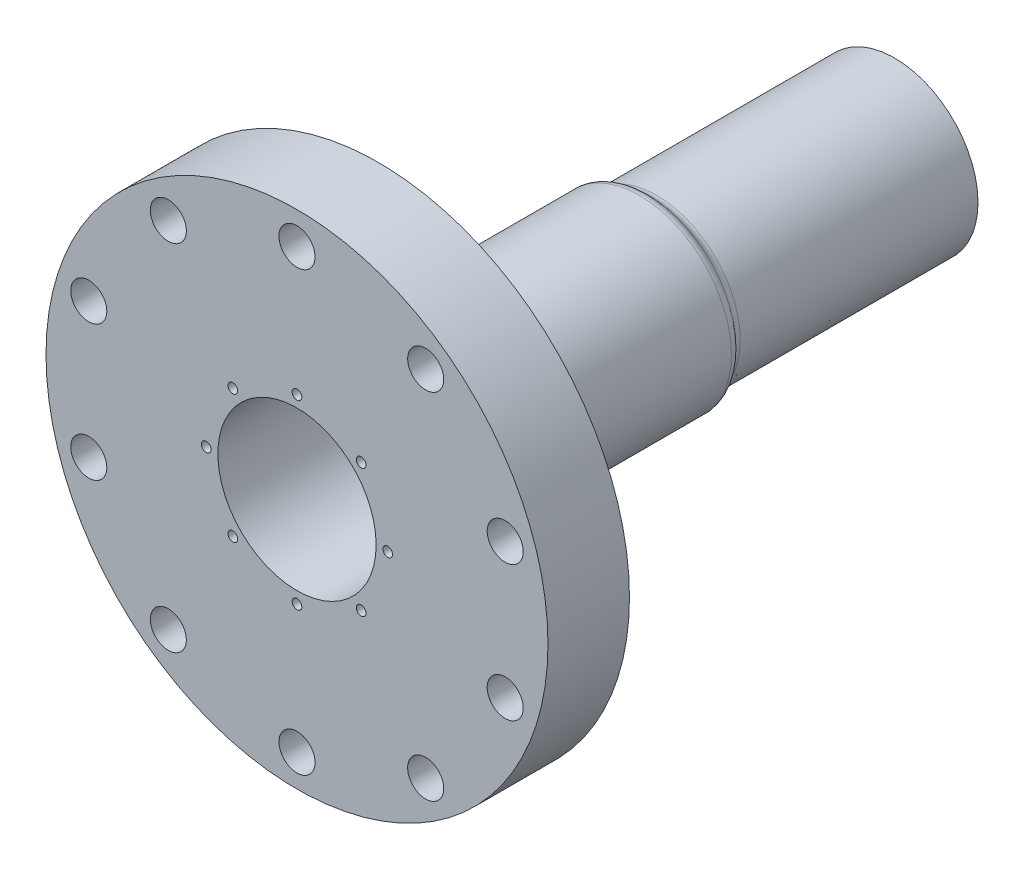
ISO-10303-21;
HEADER;
FILE_DESCRIPTION(('STEP AP214'),'2;1');
FILE_NAME('part.step','',(''),(''),'','','');
FILE_SCHEMA(('AUTOMOTIVE_DESIGN { 1 0 10303 214 1 1 1 1 }'));
ENDSEC;
DATA;
#1=APPLICATION_CONTEXT('core data for automotive mechanical design processes');
#2=APPLICATION_PROTOCOL_DEFINITION('international standard','automotive_design',2000,#1);
#3=PRODUCT_CONTEXT('',#1,'mechanical');
#4=PRODUCT('Part','Part','',(#3));
#5=PRODUCT_RELATED_PRODUCT_CATEGORY('part','',(#4));
#6=PRODUCT_DEFINITION_FORMATION('','',#4);
#7=PRODUCT_DEFINITION_CONTEXT('part definition',#1,'design');
#8=PRODUCT_DEFINITION('design','',#6,#7);
#9=PRODUCT_DEFINITION_SHAPE('','',#8);
#10=(LENGTH_UNIT() NAMED_UNIT(*) SI_UNIT(.MILLI.,.METRE.));
#11=(NAMED_UNIT(*) PLANE_ANGLE_UNIT() SI_UNIT($,.RADIAN.));
#12=(NAMED_UNIT(*) SI_UNIT($,.STERADIAN.) SOLID_ANGLE_UNIT());
#13=UNCERTAINTY_MEASURE_WITH_UNIT(LENGTH_MEASURE(1.E-05),#10,'distance_accuracy_value','');
#14=(GEOMETRIC_REPRESENTATION_CONTEXT(3) GLOBAL_UNCERTAINTY_ASSIGNED_CONTEXT((#13)) GLOBAL_UNIT_ASSIGNED_CONTEXT((#10,
#11,#12)) REPRESENTATION_CONTEXT('',''));
#15=CARTESIAN_POINT('',(0.,0.,0.));
#16=DIRECTION('',(0.,0.,1.));
#17=DIRECTION('',(1.,0.,0.));
#18=AXIS2_PLACEMENT_3D('',#15,#16,#17);
#19=CARTESIAN_POINT('',(0.,0.,-19.05));
#20=DIRECTION('',(0.,0.,1.));
#21=DIRECTION('',(1.,0.,0.));
#22=AXIS2_PLACEMENT_3D('',#19,#20,#21);
#23=PLANE('',#22);
#24=CARTESIAN_POINT('',(0.,0.,-19.05));
#25=DIRECTION('',(0.,0.,1.));
#26=DIRECTION('',(1.,0.,0.));
#27=AXIS2_PLACEMENT_3D('',#24,#25,#26);
#28=CIRCLE('',#27,58.674);
#29=CARTESIAN_POINT('',(58.674,0.,-19.05));
#30=VERTEX_POINT('',#29);
#31=EDGE_CURVE('E185',#30,#30,#28,.T.);
#32=ORIENTED_EDGE('',*,*,#31,.F.);
#33=EDGE_LOOP('',(#32));
#34=FACE_BOUND('',#33,.T.);
#35=CARTESIAN_POINT('',(0.,51.181,-19.05));
#36=DIRECTION('',(0.,0.,1.));
#37=DIRECTION('',(1.,0.,0.));
#38=AXIS2_PLACEMENT_3D('',#35,#36,#37);
#39=CIRCLE('',#38,4.2164);
#40=CARTESIAN_POINT('',(4.2164,51.181,-19.05));
#41=VERTEX_POINT('',#40);
#42=EDGE_CURVE('E181',#41,#41,#39,.F.);
#43=ORIENTED_EDGE('',*,*,#42,.F.);
#44=EDGE_LOOP('',(#43));
#45=FACE_BOUND('',#44,.T.);
#46=CARTESIAN_POINT('',(-30.0834369975811,41.4062987891042,-19.05));
#47=DIRECTION('',(0.,0.,1.));
#48=DIRECTION('',(1.,0.,0.));
#49=AXIS2_PLACEMENT_3D('',#46,#47,#48);
#50=CIRCLE('',#49,4.2164);
#51=CARTESIAN_POINT('',(-25.8670369975811,41.4062987891042,-19.05));
#52=VERTEX_POINT('',#51);
#53=EDGE_CURVE('E175',#52,#52,#50,.F.);
#54=ORIENTED_EDGE('',*,*,#53,.F.);
#55=EDGE_LOOP('',(#54));
#56=FACE_BOUND('',#55,.T.);
#57=CARTESIAN_POINT('',(-48.6760235605023,15.8157987891041,-19.05));
#58=DIRECTION('',(0.,0.,1.));
#59=DIRECTION('',(1.,0.,0.));
#60=AXIS2_PLACEMENT_3D('',#57,#58,#59);
#61=CIRCLE('',#60,4.2164);
#62=CARTESIAN_POINT('',(-44.4596235605023,15.8157987891041,-19.05));
#63=VERTEX_POINT('',#62);
#64=EDGE_CURVE('E169',#63,#63,#61,.F.);
#65=ORIENTED_EDGE('',*,*,#64,.F.);
#66=EDGE_LOOP('',(#65));
#67=FACE_BOUND('',#66,.T.);
#68=CARTESIAN_POINT('',(-48.6760235605022,-15.8157987891044,-19.05));
#69=DIRECTION('',(0.,0.,1.));
#70=DIRECTION('',(1.,0.,0.));
#71=AXIS2_PLACEMENT_3D('',#68,#69,#70);
#72=CIRCLE('',#71,4.2164);
#73=CARTESIAN_POINT('',(-44.4596235605022,-15.8157987891044,-19.05));
#74=VERTEX_POINT('',#73);
#75=EDGE_CURVE('E163',#74,#74,#72,.F.);
#76=ORIENTED_EDGE('',*,*,#75,.F.);
#77=EDGE_LOOP('',(#76));
#78=FACE_BOUND('',#77,.T.);
#79=CARTESIAN_POINT('',(-30.0834369975808,-41.4062987891044,-19.05));
#80=DIRECTION('',(0.,0.,1.));
#81=DIRECTION('',(1.,0.,0.));
#82=AXIS2_PLACEMENT_3D('',#79,#80,#81);
#83=CIRCLE('',#82,4.2164);
#84=CARTESIAN_POINT('',(-25.8670369975808,-41.4062987891044,-19.05));
#85=VERTEX_POINT('',#84);
#86=EDGE_CURVE('E157',#85,#85,#83,.F.);
#87=ORIENTED_EDGE('',*,*,#86,.F.);
#88=EDGE_LOOP('',(#87));
#89=FACE_BOUND('',#88,.T.);
#90=CARTESIAN_POINT('',(3.57395219809879E-13,-51.181,-19.05));
#91=DIRECTION('',(0.,0.,1.));
#92=DIRECTION('',(1.,0.,0.));
#93=AXIS2_PLACEMENT_3D('',#90,#91,#92);
#94=CIRCLE('',#93,4.2164);
#95=CARTESIAN_POINT('',(4.21640000000036,-51.181,-19.05));
#96=VERTEX_POINT('',#95);
#97=EDGE_CURVE('E151',#96,#96,#94,.F.);
#98=ORIENTED_EDGE('',*,*,#97,.F.);
#99=EDGE_LOOP('',(#98));
#100=FACE_BOUND('',#99,.T.);
#101=CARTESIAN_POINT('',(30.0834369975814,-41.4062987891039,-19.05));
#102=DIRECTION('',(0.,0.,1.));
#103=DIRECTION('',(1.,0.,0.));
#104=AXIS2_PLACEMENT_3D('',#101,#102,#103);
#105=CIRCLE('',#104,4.2164);
#106=CARTESIAN_POINT('',(34.2998369975814,-41.4062987891039,-19.05));
#107=VERTEX_POINT('',#106);
#108=EDGE_CURVE('E145',#107,#107,#105,.F.);
#109=ORIENTED_EDGE('',*,*,#108,.F.);
#110=EDGE_LOOP('',(#109));
#111=FACE_BOUND('',#110,.T.);
#112=CARTESIAN_POINT('',(48.6760235605024,-15.8157987891037,-19.05));
#113=DIRECTION('',(0.,0.,1.));
#114=DIRECTION('',(1.,0.,0.));
#115=AXIS2_PLACEMENT_3D('',#112,#113,#114);
#116=CIRCLE('',#115,4.2164);
#117=CARTESIAN_POINT('',(52.8924235605024,-15.8157987891037,-19.05));
#118=VERTEX_POINT('',#117);
#119=EDGE_CURVE('E139',#118,#118,#116,.F.);
#120=ORIENTED_EDGE('',*,*,#119,.F.);
#121=EDGE_LOOP('',(#120));
#122=FACE_BOUND('',#121,.T.);
#123=CARTESIAN_POINT('',(48.6760235605021,15.8157987891047,-19.05));
#124=DIRECTION('',(0.,0.,1.));
#125=DIRECTION('',(1.,0.,0.));
#126=AXIS2_PLACEMENT_3D('',#123,#124,#125);
#127=CIRCLE('',#126,4.2164);
#128=CARTESIAN_POINT('',(52.8924235605021,15.8157987891047,-19.05));
#129=VERTEX_POINT('',#128);
#130=EDGE_CURVE('E133',#129,#129,#127,.F.);
#131=ORIENTED_EDGE('',*,*,#130,.F.);
#132=EDGE_LOOP('',(#131));
#133=FACE_BOUND('',#132,.T.);
#134=CARTESIAN_POINT('',(30.0834369975805,41.4062987891046,-19.05));
#135=DIRECTION('',(0.,0.,1.));
#136=DIRECTION('',(1.,0.,0.));
#137=AXIS2_PLACEMENT_3D('',#134,#135,#136);
#138=CIRCLE('',#137,4.2164);
#139=CARTESIAN_POINT('',(34.2998369975805,41.4062987891046,-19.05));
#140=VERTEX_POINT('',#139);
#141=EDGE_CURVE('E127',#140,#140,#138,.F.);
#142=ORIENTED_EDGE('',*,*,#141,.F.);
#143=EDGE_LOOP('',(#142));
#144=FACE_BOUND('',#143,.T.);
#145=CARTESIAN_POINT('',(0.,0.,-19.05));
#146=DIRECTION('',(0.,0.,1.));
#147=DIRECTION('',(1.,0.,0.));
#148=AXIS2_PLACEMENT_3D('',#145,#146,#147);
#149=CIRCLE('',#148,21.5);
#150=CARTESIAN_POINT('',(21.5,0.,-19.05));
#151=VERTEX_POINT('',#150);
#152=EDGE_CURVE('E205',#151,#151,#149,.F.);
#153=ORIENTED_EDGE('',*,*,#152,.F.);
#154=EDGE_LOOP('',(#153));
#155=FACE_BOUND('',#154,.T.);
#156=ADVANCED_FACE('F32',(#34,#45,#56,#67,#78,#89,#100,#111,#122,#133,#144,#155),#23,.F.);
#157=CARTESIAN_POINT('',(0.,0.,-114.3));
#158=DIRECTION('',(0.,0.,-1.));
#159=DIRECTION('',(-1.,0.,0.));
#160=AXIS2_PLACEMENT_3D('',#157,#158,#159);
#161=CYLINDRICAL_SURFACE('',#160,19.);
#162=CARTESIAN_POINT('',(0.,0.,-114.3));
#163=DIRECTION('',(0.,0.,-1.));
#164=DIRECTION('',(-1.,0.,0.));
#165=AXIS2_PLACEMENT_3D('',#162,#163,#164);
#166=CIRCLE('',#165,19.);
#167=CARTESIAN_POINT('',(-19.,0.,-114.3));
#168=VERTEX_POINT('',#167);
#169=EDGE_CURVE('E199',#168,#168,#166,.T.);
#170=ORIENTED_EDGE('',*,*,#169,.F.);
#171=EDGE_LOOP('',(#170));
#172=FACE_BOUND('',#171,.T.);
#173=CARTESIAN_POINT('',(0.,0.,-130.320377846318));
#174=DIRECTION('',(0.,0.,-1.));
#175=DIRECTION('',(-1.,0.,0.));
#176=AXIS2_PLACEMENT_3D('',#173,#174,#175);
#177=CIRCLE('',#176,19.);
#178=CARTESIAN_POINT('',(-19.,0.,-130.320377846318));
#179=VERTEX_POINT('',#178);
#180=EDGE_CURVE('E202',#179,#179,#177,.F.);
#181=ORIENTED_EDGE('',*,*,#180,.F.);
#182=EDGE_LOOP('',(#181));
#183=FACE_BOUND('',#182,.T.);
#184=ADVANCED_FACE('F224',(#172,#183),#161,.F.);
#185=CARTESIAN_POINT('',(0.,0.,-139.7));
#186=DIRECTION('',(0.,0.,-1.));
#187=DIRECTION('',(-1.,0.,0.));
#188=AXIS2_PLACEMENT_3D('',#185,#186,#187);
#189=CIRCLE('',#188,19.);
#190=CARTESIAN_POINT('',(-19.,0.,-139.7));
#191=VERTEX_POINT('',#190);
#192=EDGE_CURVE('E678',#191,#191,#189,.T.);
#193=ORIENTED_EDGE('',*,*,#192,.T.);
#194=EDGE_LOOP('',(#193));
#195=FACE_BOUND('',#194,.T.);
#196=CARTESIAN_POINT('',(0.,0.,-135.766987298108));
#197=DIRECTION('',(0.,0.,1.));
#198=DIRECTION('',(1.,0.,0.));
#199=AXIS2_PLACEMENT_3D('',#196,#197,#198);
#200=CIRCLE('',#199,19.);
#201=CARTESIAN_POINT('',(19.,0.,-135.766987298108));
#202=VERTEX_POINT('',#201);
#203=EDGE_CURVE('E196',#202,#202,#200,.F.);
#204=ORIENTED_EDGE('',*,*,#203,.F.);
#205=EDGE_LOOP('',(#204));
#206=FACE_BOUND('',#205,.T.);
#207=ADVANCED_FACE('F230',(#195,#206),#161,.F.);
#208=CARTESIAN_POINT('',(0.,0.,-139.7));
#209=DIRECTION('',(0.,0.,1.));
#210=DIRECTION('',(1.,0.,0.));
#211=AXIS2_PLACEMENT_3D('',#208,#209,#210);
#212=CYLINDRICAL_SURFACE('',#211,18.5);
#213=CARTESIAN_POINT('',(0.,0.,0.));
#214=DIRECTION('',(0.,0.,1.));
#215=DIRECTION('',(1.,0.,0.));
#216=AXIS2_PLACEMENT_3D('',#213,#214,#215);
#217=CIRCLE('',#216,18.5);
#218=CARTESIAN_POINT('',(18.5,0.,0.));
#219=VERTEX_POINT('',#218);
#220=EDGE_CURVE('E188',#219,#219,#217,.T.);
#221=ORIENTED_EDGE('',*,*,#220,.T.);
#222=EDGE_LOOP('',(#221));
#223=FACE_BOUND('',#222,.T.);
#224=CARTESIAN_POINT('',(0.,0.,-114.3));
#225=DIRECTION('',(0.,0.,-1.));
#226=DIRECTION('',(-1.,0.,0.));
#227=AXIS2_PLACEMENT_3D('',#224,#225,#226);
#228=CIRCLE('',#227,18.5);
#229=CARTESIAN_POINT('',(-18.5,0.,-114.3));
#230=VERTEX_POINT('',#229);
#231=EDGE_CURVE('E82',#230,#230,#228,.F.);
#232=ORIENTED_EDGE('',*,*,#231,.F.);
#233=EDGE_LOOP('',(#232));
#234=FACE_BOUND('',#233,.T.);
#235=ADVANCED_FACE('F244',(#223,#234),#212,.F.);
#236=CARTESIAN_POINT('',(0.,0.,-139.7));
#237=DIRECTION('',(0.,0.,1.));
#238=DIRECTION('',(1.,0.,0.));
#239=AXIS2_PLACEMENT_3D('',#236,#237,#238);
#240=CYLINDRICAL_SURFACE('',#239,19.5);
#241=CARTESIAN_POINT('',(0.,0.,-84.1078672461467));
#242=DIRECTION('',(0.,0.,1.));
#243=DIRECTION('',(1.,0.,0.));
#244=AXIS2_PLACEMENT_3D('',#241,#242,#243);
#245=CIRCLE('',#244,19.5);
#246=CARTESIAN_POINT('',(19.5,0.,-84.1078672461467));
#247=VERTEX_POINT('',#246);
#248=EDGE_CURVE('E11',#247,#247,#245,.F.);
#249=ORIENTED_EDGE('',*,*,#248,.T.);
#250=EDGE_LOOP('',(#249));
#251=FACE_BOUND('',#250,.T.);
#252=CARTESIAN_POINT('',(0.,0.,-139.7));
#253=DIRECTION('',(0.,0.,1.));
#254=DIRECTION('',(1.,0.,0.));
#255=AXIS2_PLACEMENT_3D('',#252,#253,#254);
#256=CIRCLE('',#255,19.5);
#257=CARTESIAN_POINT('',(19.5,0.,-139.7));
#258=VERTEX_POINT('',#257);
#259=EDGE_CURVE('E193',#258,#258,#256,.T.);
#260=ORIENTED_EDGE('',*,*,#259,.T.);
#261=EDGE_LOOP('',(#260));
#262=FACE_BOUND('',#261,.T.);
#263=ADVANCED_FACE('F247',(#251,#262),#240,.T.);
#264=CARTESIAN_POINT('',(0.,0.,-139.7));
#265=DIRECTION('',(0.,0.,1.));
#266=DIRECTION('',(1.,0.,0.));
#267=AXIS2_PLACEMENT_3D('',#264,#265,#266);
#268=PLANE('',#267);
#269=ORIENTED_EDGE('',*,*,#192,.F.);
#270=EDGE_LOOP('',(#269));
#271=FACE_BOUND('',#270,.T.);
#272=ORIENTED_EDGE('',*,*,#259,.F.);
#273=EDGE_LOOP('',(#272));
#274=FACE_BOUND('',#273,.T.);
#275=ADVANCED_FACE('F249',(#271,#274),#268,.F.);
#276=CARTESIAN_POINT('',(0.,0.,0.));
#277=DIRECTION('',(0.,0.,1.));
#278=DIRECTION('',(1.,0.,0.));
#279=AXIS2_PLACEMENT_3D('',#276,#277,#278);
#280=PLANE('',#279);
#281=CARTESIAN_POINT('',(15.,-15.,0.));
#282=DIRECTION('',(0.,0.,1.));
#283=DIRECTION('',(1.,0.,0.));
#284=AXIS2_PLACEMENT_3D('',#281,#282,#283);
#285=CIRCLE('',#284,1.13029999999999);
#286=CARTESIAN_POINT('',(16.1303,-15.,0.));
#287=VERTEX_POINT('',#286);
#288=EDGE_CURVE('E76',#287,#287,#285,.T.);
#289=ORIENTED_EDGE('',*,*,#288,.F.);
#290=EDGE_LOOP('',(#289));
#291=FACE_BOUND('',#290,.T.);
#292=CARTESIAN_POINT('',(-15.,-15.,0.));
#293=DIRECTION('',(0.,0.,1.));
#294=DIRECTION('',(1.,0.,0.));
#295=AXIS2_PLACEMENT_3D('',#292,#293,#294);
#296=CIRCLE('',#295,1.13029999999999);
#297=CARTESIAN_POINT('',(-13.8697,-15.,0.));
#298=VERTEX_POINT('',#297);
#299=EDGE_CURVE('E75',#298,#298,#296,.T.);
#300=ORIENTED_EDGE('',*,*,#299,.F.);
#301=EDGE_LOOP('',(#300));
#302=FACE_BOUND('',#301,.T.);
#303=CARTESIAN_POINT('',(-15.,15.,0.));
#304=DIRECTION('',(0.,0.,1.));
#305=DIRECTION('',(1.,0.,0.));
#306=AXIS2_PLACEMENT_3D('',#303,#304,#305);
#307=CIRCLE('',#306,1.13029999999999);
#308=CARTESIAN_POINT('',(-13.8697,15.,0.));
#309=VERTEX_POINT('',#308);
#310=EDGE_CURVE('E88',#309,#309,#307,.T.);
#311=ORIENTED_EDGE('',*,*,#310,.F.);
#312=EDGE_LOOP('',(#311));
#313=FACE_BOUND('',#312,.T.);
#314=CARTESIAN_POINT('',(15.,15.,0.));
#315=DIRECTION('',(0.,0.,1.));
#316=DIRECTION('',(1.,0.,0.));
#317=AXIS2_PLACEMENT_3D('',#314,#315,#316);
#318=CIRCLE('',#317,1.13029999999999);
#319=CARTESIAN_POINT('',(16.1303,15.,0.));
#320=VERTEX_POINT('',#319);
#321=EDGE_CURVE('E94',#320,#320,#318,.T.);
#322=ORIENTED_EDGE('',*,*,#321,.F.);
#323=EDGE_LOOP('',(#322));
#324=FACE_BOUND('',#323,.T.);
#325=CARTESIAN_POINT('',(0.,21.2132034355964,0.));
#326=DIRECTION('',(0.,0.,1.));
#327=DIRECTION('',(1.,0.,0.));
#328=AXIS2_PLACEMENT_3D('',#325,#326,#327);
#329=CIRCLE('',#328,1.13029999999999);
#330=CARTESIAN_POINT('',(1.13030000000002,21.2132034355964,0.));
#331=VERTEX_POINT('',#330);
#332=EDGE_CURVE('E100',#331,#331,#329,.T.);
#333=ORIENTED_EDGE('',*,*,#332,.F.);
#334=EDGE_LOOP('',(#333));
#335=FACE_BOUND('',#334,.T.);
#336=CARTESIAN_POINT('',(-21.2132034355965,0.,0.));
#337=DIRECTION('',(0.,0.,1.));
#338=DIRECTION('',(1.,0.,0.));
#339=AXIS2_PLACEMENT_3D('',#336,#337,#338);
#340=CIRCLE('',#339,1.13029999999999);
#341=CARTESIAN_POINT('',(-20.0829034355965,0.,0.));
#342=VERTEX_POINT('',#341);
#343=EDGE_CURVE('E106',#342,#342,#340,.T.);
#344=ORIENTED_EDGE('',*,*,#343,.F.);
#345=EDGE_LOOP('',(#344));
#346=FACE_BOUND('',#345,.T.);
#347=CARTESIAN_POINT('',(21.2132034355965,0.,0.));
#348=DIRECTION('',(0.,0.,1.));
#349=DIRECTION('',(1.,0.,0.));
#350=AXIS2_PLACEMENT_3D('',#347,#348,#349);
#351=CIRCLE('',#350,1.13029999999999);
#352=CARTESIAN_POINT('',(22.3435034355964,0.,0.));
#353=VERTEX_POINT('',#352);
#354=EDGE_CURVE('E112',#353,#353,#351,.T.);
#355=ORIENTED_EDGE('',*,*,#354,.F.);
#356=EDGE_LOOP('',(#355));
#357=FACE_BOUND('',#356,.T.);
#358=CARTESIAN_POINT('',(0.,-21.2132034355964,0.));
#359=DIRECTION('',(0.,0.,1.));
#360=DIRECTION('',(1.,0.,0.));
#361=AXIS2_PLACEMENT_3D('',#358,#359,#360);
#362=CIRCLE('',#361,1.13029999999999);
#363=CARTESIAN_POINT('',(1.13029999999999,-21.2132034355964,0.));
#364=VERTEX_POINT('',#363);
#365=EDGE_CURVE('E118',#364,#364,#362,.T.);
#366=ORIENTED_EDGE('',*,*,#365,.F.);
#367=EDGE_LOOP('',(#366));
#368=FACE_BOUND('',#367,.T.);
#369=CARTESIAN_POINT('',(30.0834369975805,41.4062987891046,0.));
#370=DIRECTION('',(0.,0.,1.));
#371=DIRECTION('',(0.809016994374955,-0.587785252292462,0.));
#372=AXIS2_PLACEMENT_3D('',#369,#370,#371);
#373=CIRCLE('',#372,4.2164);
#374=CARTESIAN_POINT('',(33.4945762526631,38.9279610513386,0.));
#375=VERTEX_POINT('',#374);
#376=EDGE_CURVE('E124',#375,#375,#373,.T.);
#377=ORIENTED_EDGE('',*,*,#376,.F.);
#378=EDGE_LOOP('',(#377));
#379=FACE_BOUND('',#378,.T.);
#380=CARTESIAN_POINT('',(48.6760235605021,15.8157987891047,0.));
#381=DIRECTION('',(0.,0.,1.));
#382=DIRECTION('',(0.309016994374958,-0.95105651629515,0.));
#383=AXIS2_PLACEMENT_3D('',#380,#381,#382);
#384=CIRCLE('',#383,4.2164);
#385=CARTESIAN_POINT('',(49.9789628155847,11.8057640937979,0.));
#386=VERTEX_POINT('',#385);
#387=EDGE_CURVE('E130',#386,#386,#384,.T.);
#388=ORIENTED_EDGE('',*,*,#387,.F.);
#389=EDGE_LOOP('',(#388));
#390=FACE_BOUND('',#389,.T.);
#391=CARTESIAN_POINT('',(48.6760235605024,-15.8157987891037,0.));
#392=DIRECTION('',(0.,0.,1.));
#393=DIRECTION('',(-0.309016994374938,-0.951056516295157,0.));
#394=AXIS2_PLACEMENT_3D('',#391,#392,#393);
#395=CIRCLE('',#394,4.2164);
#396=CARTESIAN_POINT('',(47.3730843054199,-19.8258334844106,0.));
#397=VERTEX_POINT('',#396);
#398=EDGE_CURVE('E136',#397,#397,#395,.T.);
#399=ORIENTED_EDGE('',*,*,#398,.F.);
#400=EDGE_LOOP('',(#399));
#401=FACE_BOUND('',#400,.T.);
#402=CARTESIAN_POINT('',(30.0834369975814,-41.4062987891039,0.));
#403=DIRECTION('',(0.,0.,1.));
#404=DIRECTION('',(-0.809016994374942,-0.58778525229248,0.));
#405=AXIS2_PLACEMENT_3D('',#402,#403,#404);
#406=CIRCLE('',#405,4.2164);
#407=CARTESIAN_POINT('',(26.6722977424989,-43.8846365268699,0.));
#408=VERTEX_POINT('',#407);
#409=EDGE_CURVE('E142',#408,#408,#406,.T.);
#410=ORIENTED_EDGE('',*,*,#409,.F.);
#411=EDGE_LOOP('',(#410));
#412=FACE_BOUND('',#411,.T.);
#413=CARTESIAN_POINT('',(3.57395219809879E-13,-51.181,0.));
#414=DIRECTION('',(0.,0.,1.));
#415=DIRECTION('',(-1.,0.,0.));
#416=AXIS2_PLACEMENT_3D('',#413,#414,#415);
#417=CIRCLE('',#416,4.2164);
#418=CARTESIAN_POINT('',(-4.21639999999964,-51.181,0.));
#419=VERTEX_POINT('',#418);
#420=EDGE_CURVE('E148',#419,#419,#417,.T.);
#421=ORIENTED_EDGE('',*,*,#420,.F.);
#422=EDGE_LOOP('',(#421));
#423=FACE_BOUND('',#422,.T.);
#424=CARTESIAN_POINT('',(-30.0834369975808,-41.4062987891044,0.));
#425=DIRECTION('',(0.,0.,1.));
#426=DIRECTION('',(-0.809016994374951,0.587785252292469,0.));
#427=AXIS2_PLACEMENT_3D('',#424,#425,#426);
#428=CIRCLE('',#427,4.2164);
#429=CARTESIAN_POINT('',(-33.4945762526634,-38.9279610513384,0.));
#430=VERTEX_POINT('',#429);
#431=EDGE_CURVE('E154',#430,#430,#428,.T.);
#432=ORIENTED_EDGE('',*,*,#431,.F.);
#433=EDGE_LOOP('',(#432));
#434=FACE_BOUND('',#433,.T.);
#435=CARTESIAN_POINT('',(-48.6760235605022,-15.8157987891044,0.));
#436=DIRECTION('',(0.,0.,1.));
#437=DIRECTION('',(-0.309016994374952,0.951056516295152,0.));
#438=AXIS2_PLACEMENT_3D('',#435,#436,#437);
#439=CIRCLE('',#438,4.2164);
#440=CARTESIAN_POINT('',(-49.9789628155847,-11.8057640937975,0.));
#441=VERTEX_POINT('',#440);
#442=EDGE_CURVE('E160',#441,#441,#439,.T.);
#443=ORIENTED_EDGE('',*,*,#442,.F.);
#444=EDGE_LOOP('',(#443));
#445=FACE_BOUND('',#444,.T.);
#446=CARTESIAN_POINT('',(-48.6760235605023,15.8157987891041,0.));
#447=DIRECTION('',(0.,0.,1.));
#448=DIRECTION('',(0.309016994374945,0.951056516295155,0.));
#449=AXIS2_PLACEMENT_3D('',#446,#447,#448);
#450=CIRCLE('',#449,4.2164);
#451=CARTESIAN_POINT('',(-47.3730843054198,19.8258334844109,0.));
#452=VERTEX_POINT('',#451);
#453=EDGE_CURVE('E166',#452,#452,#450,.T.);
#454=ORIENTED_EDGE('',*,*,#453,.F.);
#455=EDGE_LOOP('',(#454));
#456=FACE_BOUND('',#455,.T.);
#457=CARTESIAN_POINT('',(-30.0834369975811,41.4062987891042,0.));
#458=DIRECTION('',(0.,0.,1.));
#459=DIRECTION('',(0.809016994374947,0.587785252292474,0.));
#460=AXIS2_PLACEMENT_3D('',#457,#458,#459);
#461=CIRCLE('',#460,4.2164);
#462=CARTESIAN_POINT('',(-26.6722977424986,43.8846365268701,0.));
#463=VERTEX_POINT('',#462);
#464=EDGE_CURVE('E172',#463,#463,#461,.T.);
#465=ORIENTED_EDGE('',*,*,#464,.F.);
#466=EDGE_LOOP('',(#465));
#467=FACE_BOUND('',#466,.T.);
#468=CARTESIAN_POINT('',(0.,51.181,0.));
#469=DIRECTION('',(0.,0.,1.));
#470=DIRECTION('',(1.,0.,0.));
#471=AXIS2_PLACEMENT_3D('',#468,#469,#470);
#472=CIRCLE('',#471,4.2164);
#473=CARTESIAN_POINT('',(4.2164,51.181,0.));
#474=VERTEX_POINT('',#473);
#475=EDGE_CURVE('E178',#474,#474,#472,.T.);
#476=ORIENTED_EDGE('',*,*,#475,.F.);
#477=EDGE_LOOP('',(#476));
#478=FACE_BOUND('',#477,.T.);
#479=ORIENTED_EDGE('',*,*,#220,.F.);
#480=EDGE_LOOP('',(#479));
#481=FACE_BOUND('',#480,.T.);
#482=CARTESIAN_POINT('',(0.,0.,0.));
#483=DIRECTION('',(0.,0.,1.));
#484=DIRECTION('',(1.,0.,0.));
#485=AXIS2_PLACEMENT_3D('',#482,#483,#484);
#486=CIRCLE('',#485,58.674);
#487=CARTESIAN_POINT('',(58.674,0.,0.));
#488=VERTEX_POINT('',#487);
#489=EDGE_CURVE('E184',#488,#488,#486,.T.);
#490=ORIENTED_EDGE('',*,*,#489,.T.);
#491=EDGE_LOOP('',(#490));
#492=FACE_BOUND('',#491,.T.);
#493=ADVANCED_FACE('F242',(#291,#302,#313,#324,#335,#346,#357,#368,#379,#390,#401,#412,#423,
#434,#445,#456,#467,#478,#481,#492),#280,.T.);
#494=CARTESIAN_POINT('',(0.,0.,-19.05));
#495=DIRECTION('',(0.,0.,1.));
#496=DIRECTION('',(1.,0.,0.));
#497=AXIS2_PLACEMENT_3D('',#494,#495,#496);
#498=CYLINDRICAL_SURFACE('',#497,58.674);
#499=CARTESIAN_POINT('',(58.674,0.,-19.05));
#500=CARTESIAN_POINT('',(58.674,0.,-18.8515625));
#501=CARTESIAN_POINT('',(58.674,0.,-18.653125));
#502=CARTESIAN_POINT('',(58.674,0.,-18.25625));
#503=CARTESIAN_POINT('',(58.674,0.,-18.0578125));
#504=CARTESIAN_POINT('',(58.674,0.,-17.6609375));
#505=CARTESIAN_POINT('',(58.674,0.,-17.4625));
#506=CARTESIAN_POINT('',(58.674,0.,-17.065625));
#507=CARTESIAN_POINT('',(58.674,0.,-16.8671875));
#508=CARTESIAN_POINT('',(58.674,0.,-16.4703125));
#509=CARTESIAN_POINT('',(58.674,0.,-16.271875));
#510=CARTESIAN_POINT('',(58.674,0.,-15.875));
#511=CARTESIAN_POINT('',(58.674,0.,-15.6765625));
#512=CARTESIAN_POINT('',(58.674,0.,-15.2796875));
#513=CARTESIAN_POINT('',(58.674,0.,-15.08125));
#514=CARTESIAN_POINT('',(58.674,0.,-14.684375));
#515=CARTESIAN_POINT('',(58.674,0.,-14.4859375));
#516=CARTESIAN_POINT('',(58.674,0.,-14.0890625));
#517=CARTESIAN_POINT('',(58.674,0.,-13.890625));
#518=CARTESIAN_POINT('',(58.674,0.,-13.49375));
#519=CARTESIAN_POINT('',(58.674,0.,-13.2953125));
#520=CARTESIAN_POINT('',(58.674,0.,-12.8984375));
#521=CARTESIAN_POINT('',(58.674,0.,-12.7));
#522=CARTESIAN_POINT('',(58.674,0.,-12.303125));
#523=CARTESIAN_POINT('',(58.674,0.,-12.1046875));
#524=CARTESIAN_POINT('',(58.674,0.,-11.7078125));
#525=CARTESIAN_POINT('',(58.674,0.,-11.509375));
#526=CARTESIAN_POINT('',(58.674,0.,-11.1125));
#527=CARTESIAN_POINT('',(58.674,0.,-10.9140625));
#528=CARTESIAN_POINT('',(58.674,0.,-10.5171875));
#529=CARTESIAN_POINT('',(58.674,0.,-10.31875));
#530=CARTESIAN_POINT('',(58.674,0.,-9.921875));
#531=CARTESIAN_POINT('',(58.674,0.,-9.7234375));
#532=CARTESIAN_POINT('',(58.674,0.,-9.3265625));
#533=CARTESIAN_POINT('',(58.674,0.,-9.128125));
#534=CARTESIAN_POINT('',(58.674,0.,-8.73125));
#535=CARTESIAN_POINT('',(58.674,0.,-8.5328125));
#536=CARTESIAN_POINT('',(58.674,0.,-8.1359375));
#537=CARTESIAN_POINT('',(58.674,0.,-7.9375));
#538=CARTESIAN_POINT('',(58.674,0.,-7.540625));
#539=CARTESIAN_POINT('',(58.674,0.,-7.3421875));
#540=CARTESIAN_POINT('',(58.674,0.,-6.9453125));
#541=CARTESIAN_POINT('',(58.674,0.,-6.746875));
#542=CARTESIAN_POINT('',(58.674,0.,-6.35));
#543=CARTESIAN_POINT('',(58.674,0.,-6.1515625));
#544=CARTESIAN_POINT('',(58.674,0.,-5.7546875));
#545=CARTESIAN_POINT('',(58.674,0.,-5.55625));
#546=CARTESIAN_POINT('',(58.674,0.,-5.159375));
#547=CARTESIAN_POINT('',(58.674,0.,-4.9609375));
#548=CARTESIAN_POINT('',(58.674,0.,-4.5640625));
#549=CARTESIAN_POINT('',(58.674,0.,-4.365625));
#550=CARTESIAN_POINT('',(58.674,0.,-3.96875));
#551=CARTESIAN_POINT('',(58.674,0.,-3.7703125));
#552=CARTESIAN_POINT('',(58.674,0.,-3.3734375));
#553=CARTESIAN_POINT('',(58.674,0.,-3.175));
#554=CARTESIAN_POINT('',(58.674,0.,-2.778125));
#555=CARTESIAN_POINT('',(58.674,0.,-2.5796875));
#556=CARTESIAN_POINT('',(58.674,0.,-2.1828125));
#557=CARTESIAN_POINT('',(58.674,0.,-1.984375));
#558=CARTESIAN_POINT('',(58.674,0.,-1.5875));
#559=CARTESIAN_POINT('',(58.674,0.,-1.3890625));
#560=CARTESIAN_POINT('',(58.674,0.,-0.992187500000001));
#561=CARTESIAN_POINT('',(58.674,0.,-0.793750000000001));
#562=CARTESIAN_POINT('',(58.674,0.,-0.396875));
#563=CARTESIAN_POINT('',(58.674,0.,-0.1984375));
#564=CARTESIAN_POINT('',(58.674,0.,0.));
#565=B_SPLINE_CURVE_WITH_KNOTS('',3,(#499,#500,#501,#502,#503,#504,#505,#506,#507,#508,#509,
#510,#511,#512,#513,#514,#515,#516,#517,#518,#519,#520,#521,#522,#523,#524,#525,#526,#527,#528,
#529,#530,#531,#532,#533,#534,#535,#536,#537,#538,#539,#540,#541,#542,#543,#544,#545,#546,#547,
#548,#549,#550,#551,#552,#553,#554,#555,#556,#557,#558,#559,#560,#561,#562,#563,#564),
.UNSPECIFIED.,.F.,.F.,(4,2,2,2,2,2,2,2,2,2,2,2,2,2,2,2,2,2,2,2,2,2,2,2,2,2,2,2,2,2,2,2,4),(0.,
0.595312499999997,1.190625,1.7859375,2.38125,2.9765625,3.571875,4.1671875,4.7625,5.3578125,
5.953125,6.5484375,7.14375,7.7390625,8.334375,8.9296875,9.525,10.1203125,10.715625,11.3109375,
11.90625,12.5015625,13.096875,13.6921875,14.2875,14.8828125,15.478125,16.0734375,16.66875,
17.2640625,17.859375,18.4546875,19.05),.UNSPECIFIED.);
#566=EDGE_CURVE('BSEAM239',#30,#488,#565,.T.);
#567=ORIENTED_EDGE('',*,*,#31,.T.);
#568=ORIENTED_EDGE('',*,*,#489,.F.);
#569=ORIENTED_EDGE('',*,*,#566,.T.);
#570=ORIENTED_EDGE('',*,*,#566,.F.);
#571=EDGE_LOOP('',(#567,#569,#568,#570));
#572=FACE_BOUND('',#571,.T.);
#573=ADVANCED_FACE('F239',(#572),#498,.T.);
#574=CARTESIAN_POINT('',(0.,51.181,-139.701));
#575=DIRECTION('',(0.,0.,1.));
#576=DIRECTION('',(1.,0.,0.));
#577=AXIS2_PLACEMENT_3D('',#574,#575,#576);
#578=CYLINDRICAL_SURFACE('',#577,4.2164);
#579=ORIENTED_EDGE('',*,*,#475,.T.);
#580=EDGE_LOOP('',(#579));
#581=FACE_BOUND('',#580,.T.);
#582=ORIENTED_EDGE('',*,*,#42,.T.);
#583=EDGE_LOOP('',(#582));
#584=FACE_BOUND('',#583,.T.);
#585=ADVANCED_FACE('F237',(#581,#584),#578,.F.);
#586=CARTESIAN_POINT('',(-30.0834369975811,41.4062987891042,-139.701));
#587=DIRECTION('',(0.,0.,1.));
#588=DIRECTION('',(1.,0.,0.));
#589=AXIS2_PLACEMENT_3D('',#586,#587,#588);
#590=CYLINDRICAL_SURFACE('',#589,4.2164);
#591=ORIENTED_EDGE('',*,*,#464,.T.);
#592=EDGE_LOOP('',(#591));
#593=FACE_BOUND('',#592,.T.);
#594=ORIENTED_EDGE('',*,*,#53,.T.);
#595=EDGE_LOOP('',(#594));
#596=FACE_BOUND('',#595,.T.);
#597=ADVANCED_FACE('F289',(#593,#596),#590,.F.);
#598=CARTESIAN_POINT('',(-48.6760235605023,15.8157987891041,-139.701));
#599=DIRECTION('',(0.,0.,1.));
#600=DIRECTION('',(1.,0.,0.));
#601=AXIS2_PLACEMENT_3D('',#598,#599,#600);
#602=CYLINDRICAL_SURFACE('',#601,4.2164);
#603=ORIENTED_EDGE('',*,*,#453,.T.);
#604=EDGE_LOOP('',(#603));
#605=FACE_BOUND('',#604,.T.);
#606=ORIENTED_EDGE('',*,*,#64,.T.);
#607=EDGE_LOOP('',(#606));
#608=FACE_BOUND('',#607,.T.);
#609=ADVANCED_FACE('F296',(#605,#608),#602,.F.);
#610=CARTESIAN_POINT('',(-48.6760235605022,-15.8157987891044,-139.701));
#611=DIRECTION('',(0.,0.,1.));
#612=DIRECTION('',(1.,0.,0.));
#613=AXIS2_PLACEMENT_3D('',#610,#611,#612);
#614=CYLINDRICAL_SURFACE('',#613,4.2164);
#615=ORIENTED_EDGE('',*,*,#442,.T.);
#616=EDGE_LOOP('',(#615));
#617=FACE_BOUND('',#616,.T.);
#618=ORIENTED_EDGE('',*,*,#75,.T.);
#619=EDGE_LOOP('',(#618));
#620=FACE_BOUND('',#619,.T.);
#621=ADVANCED_FACE('F303',(#617,#620),#614,.F.);
#622=CARTESIAN_POINT('',(-30.0834369975808,-41.4062987891044,-139.701));
#623=DIRECTION('',(0.,0.,1.));
#624=DIRECTION('',(1.,0.,0.));
#625=AXIS2_PLACEMENT_3D('',#622,#623,#624);
#626=CYLINDRICAL_SURFACE('',#625,4.2164);
#627=ORIENTED_EDGE('',*,*,#431,.T.);
#628=EDGE_LOOP('',(#627));
#629=FACE_BOUND('',#628,.T.);
#630=ORIENTED_EDGE('',*,*,#86,.T.);
#631=EDGE_LOOP('',(#630));
#632=FACE_BOUND('',#631,.T.);
#633=ADVANCED_FACE('F311',(#629,#632),#626,.F.);
#634=CARTESIAN_POINT('',(3.57395219809879E-13,-51.181,-139.701));
#635=DIRECTION('',(0.,0.,1.));
#636=DIRECTION('',(1.,0.,0.));
#637=AXIS2_PLACEMENT_3D('',#634,#635,#636);
#638=CYLINDRICAL_SURFACE('',#637,4.2164);
#639=ORIENTED_EDGE('',*,*,#420,.T.);
#640=EDGE_LOOP('',(#639));
#641=FACE_BOUND('',#640,.T.);
#642=ORIENTED_EDGE('',*,*,#97,.T.);
#643=EDGE_LOOP('',(#642));
#644=FACE_BOUND('',#643,.T.);
#645=ADVANCED_FACE('F319',(#641,#644),#638,.F.);
#646=CARTESIAN_POINT('',(30.0834369975814,-41.4062987891039,-139.701));
#647=DIRECTION('',(0.,0.,1.));
#648=DIRECTION('',(1.,0.,0.));
#649=AXIS2_PLACEMENT_3D('',#646,#647,#648);
#650=CYLINDRICAL_SURFACE('',#649,4.2164);
#651=ORIENTED_EDGE('',*,*,#409,.T.);
#652=EDGE_LOOP('',(#651));
#653=FACE_BOUND('',#652,.T.);
#654=ORIENTED_EDGE('',*,*,#108,.T.);
#655=EDGE_LOOP('',(#654));
#656=FACE_BOUND('',#655,.T.);
#657=ADVANCED_FACE('F327',(#653,#656),#650,.F.);
#658=CARTESIAN_POINT('',(48.6760235605024,-15.8157987891037,-139.701));
#659=DIRECTION('',(0.,0.,1.));
#660=DIRECTION('',(1.,0.,0.));
#661=AXIS2_PLACEMENT_3D('',#658,#659,#660);
#662=CYLINDRICAL_SURFACE('',#661,4.2164);
#663=ORIENTED_EDGE('',*,*,#398,.T.);
#664=EDGE_LOOP('',(#663));
#665=FACE_BOUND('',#664,.T.);
#666=ORIENTED_EDGE('',*,*,#119,.T.);
#667=EDGE_LOOP('',(#666));
#668=FACE_BOUND('',#667,.T.);
#669=ADVANCED_FACE('F335',(#665,#668),#662,.F.);
#670=CARTESIAN_POINT('',(48.6760235605021,15.8157987891047,-139.701));
#671=DIRECTION('',(0.,0.,1.));
#672=DIRECTION('',(1.,0.,0.));
#673=AXIS2_PLACEMENT_3D('',#670,#671,#672);
#674=CYLINDRICAL_SURFACE('',#673,4.2164);
#675=ORIENTED_EDGE('',*,*,#387,.T.);
#676=EDGE_LOOP('',(#675));
#677=FACE_BOUND('',#676,.T.);
#678=ORIENTED_EDGE('',*,*,#130,.T.);
#679=EDGE_LOOP('',(#678));
#680=FACE_BOUND('',#679,.T.);
#681=ADVANCED_FACE('F343',(#677,#680),#674,.F.);
#682=CARTESIAN_POINT('',(30.0834369975805,41.4062987891046,-139.701));
#683=DIRECTION('',(0.,0.,1.));
#684=DIRECTION('',(1.,0.,0.));
#685=AXIS2_PLACEMENT_3D('',#682,#683,#684);
#686=CYLINDRICAL_SURFACE('',#685,4.2164);
#687=ORIENTED_EDGE('',*,*,#376,.T.);
#688=EDGE_LOOP('',(#687));
#689=FACE_BOUND('',#688,.T.);
#690=ORIENTED_EDGE('',*,*,#141,.T.);
#691=EDGE_LOOP('',(#690));
#692=FACE_BOUND('',#691,.T.);
#693=ADVANCED_FACE('F351',(#689,#692),#686,.F.);
#694=CARTESIAN_POINT('',(0.,-21.2132034355964,-7.62));
#695=DIRECTION('',(0.,0.,1.));
#696=DIRECTION('',(1.,0.,0.));
#697=AXIS2_PLACEMENT_3D('',#694,#695,#696);
#698=CONICAL_SURFACE('',#697,1.13029999999999,1.02974425867665);
#699=CARTESIAN_POINT('',(0.,-21.2132034355964,-8.29915275768685));
#700=VERTEX_POINT('',#699);
#701=VERTEX_LOOP('',#700);
#702=FACE_BOUND('',#701,.T.);
#703=CARTESIAN_POINT('',(0.,-21.2132034355964,-7.62));
#704=DIRECTION('',(0.,0.,1.));
#705=DIRECTION('',(1.,0.,0.));
#706=AXIS2_PLACEMENT_3D('',#703,#704,#705);
#707=CIRCLE('',#706,1.13029999999999);
#708=CARTESIAN_POINT('',(1.13029999999998,-21.2132034355964,-7.62));
#709=VERTEX_POINT('',#708);
#710=EDGE_CURVE('E121',#709,#709,#707,.T.);
#711=ORIENTED_EDGE('',*,*,#710,.T.);
#712=EDGE_LOOP('',(#711));
#713=FACE_BOUND('',#712,.T.);
#714=ADVANCED_FACE('F358',(#702,#713),#698,.F.);
#715=CARTESIAN_POINT('',(0.,-21.2132034355964,0.));
#716=DIRECTION('',(0.,0.,1.));
#717=DIRECTION('',(1.,0.,0.));
#718=AXIS2_PLACEMENT_3D('',#715,#716,#717);
#719=CYLINDRICAL_SURFACE('',#718,1.13029999999999);
#720=ORIENTED_EDGE('',*,*,#710,.F.);
#721=EDGE_LOOP('',(#720));
#722=FACE_BOUND('',#721,.T.);
#723=ORIENTED_EDGE('',*,*,#365,.T.);
#724=EDGE_LOOP('',(#723));
#725=FACE_BOUND('',#724,.T.);
#726=ADVANCED_FACE('F365',(#722,#725),#719,.F.);
#727=CARTESIAN_POINT('',(21.2132034355965,0.,-7.62));
#728=DIRECTION('',(0.,0.,1.));
#729=DIRECTION('',(1.,0.,0.));
#730=AXIS2_PLACEMENT_3D('',#727,#728,#729);
#731=CONICAL_SURFACE('',#730,1.13029999999999,1.02974425867665);
#732=CARTESIAN_POINT('',(21.2132034355965,0.,-8.29915275768685));
#733=VERTEX_POINT('',#732);
#734=VERTEX_LOOP('',#733);
#735=FACE_BOUND('',#734,.T.);
#736=CARTESIAN_POINT('',(21.2132034355965,0.,-7.62));
#737=DIRECTION('',(0.,0.,1.));
#738=DIRECTION('',(1.,0.,0.));
#739=AXIS2_PLACEMENT_3D('',#736,#737,#738);
#740=CIRCLE('',#739,1.13029999999999);
#741=CARTESIAN_POINT('',(22.3435034355964,0.,-7.62));
#742=VERTEX_POINT('',#741);
#743=EDGE_CURVE('E115',#742,#742,#740,.T.);
#744=ORIENTED_EDGE('',*,*,#743,.T.);
#745=EDGE_LOOP('',(#744));
#746=FACE_BOUND('',#745,.T.);
#747=ADVANCED_FACE('F373',(#735,#746),#731,.F.);
#748=CARTESIAN_POINT('',(21.2132034355965,0.,0.));
#749=DIRECTION('',(0.,0.,1.));
#750=DIRECTION('',(1.,0.,0.));
#751=AXIS2_PLACEMENT_3D('',#748,#749,#750);
#752=CYLINDRICAL_SURFACE('',#751,1.13029999999999);
#753=ORIENTED_EDGE('',*,*,#743,.F.);
#754=EDGE_LOOP('',(#753));
#755=FACE_BOUND('',#754,.T.);
#756=ORIENTED_EDGE('',*,*,#354,.T.);
#757=EDGE_LOOP('',(#756));
#758=FACE_BOUND('',#757,.T.);
#759=ADVANCED_FACE('F381',(#755,#758),#752,.F.);
#760=CARTESIAN_POINT('',(-21.2132034355965,0.,-7.62));
#761=DIRECTION('',(0.,0.,1.));
#762=DIRECTION('',(1.,0.,0.));
#763=AXIS2_PLACEMENT_3D('',#760,#761,#762);
#764=CONICAL_SURFACE('',#763,1.13029999999999,1.02974425867665);
#765=CARTESIAN_POINT('',(-21.2132034355965,0.,-8.29915275768685));
#766=VERTEX_POINT('',#765);
#767=VERTEX_LOOP('',#766);
#768=FACE_BOUND('',#767,.T.);
#769=CARTESIAN_POINT('',(-21.2132034355965,0.,-7.62));
#770=DIRECTION('',(0.,0.,1.));
#771=DIRECTION('',(1.,0.,0.));
#772=AXIS2_PLACEMENT_3D('',#769,#770,#771);
#773=CIRCLE('',#772,1.13029999999999);
#774=CARTESIAN_POINT('',(-20.0829034355965,0.,-7.62));
#775=VERTEX_POINT('',#774);
#776=EDGE_CURVE('E109',#775,#775,#773,.T.);
#777=ORIENTED_EDGE('',*,*,#776,.T.);
#778=EDGE_LOOP('',(#777));
#779=FACE_BOUND('',#778,.T.);
#780=ADVANCED_FACE('F388',(#768,#779),#764,.F.);
#781=CARTESIAN_POINT('',(-21.2132034355965,0.,0.));
#782=DIRECTION('',(0.,0.,1.));
#783=DIRECTION('',(1.,0.,0.));
#784=AXIS2_PLACEMENT_3D('',#781,#782,#783);
#785=CYLINDRICAL_SURFACE('',#784,1.13029999999999);
#786=ORIENTED_EDGE('',*,*,#776,.F.);
#787=EDGE_LOOP('',(#786));
#788=FACE_BOUND('',#787,.T.);
#789=ORIENTED_EDGE('',*,*,#343,.T.);
#790=EDGE_LOOP('',(#789));
#791=FACE_BOUND('',#790,.T.);
#792=ADVANCED_FACE('F396',(#788,#791),#785,.F.);
#793=CARTESIAN_POINT('',(0.,21.2132034355964,-7.62));
#794=DIRECTION('',(0.,0.,1.));
#795=DIRECTION('',(1.,0.,0.));
#796=AXIS2_PLACEMENT_3D('',#793,#794,#795);
#797=CONICAL_SURFACE('',#796,1.13029999999999,1.02974425867665);
#798=CARTESIAN_POINT('',(0.,21.2132034355964,-8.29915275768685));
#799=VERTEX_POINT('',#798);
#800=VERTEX_LOOP('',#799);
#801=FACE_BOUND('',#800,.T.);
#802=CARTESIAN_POINT('',(0.,21.2132034355964,-7.62));
#803=DIRECTION('',(0.,0.,1.));
#804=DIRECTION('',(1.,0.,0.));
#805=AXIS2_PLACEMENT_3D('',#802,#803,#804);
#806=CIRCLE('',#805,1.13029999999999);
#807=CARTESIAN_POINT('',(1.13030000000002,21.2132034355964,-7.62));
#808=VERTEX_POINT('',#807);
#809=EDGE_CURVE('E103',#808,#808,#806,.T.);
#810=ORIENTED_EDGE('',*,*,#809,.T.);
#811=EDGE_LOOP('',(#810));
#812=FACE_BOUND('',#811,.T.);
#813=ADVANCED_FACE('F404',(#801,#812),#797,.F.);
#814=CARTESIAN_POINT('',(0.,21.2132034355964,0.));
#815=DIRECTION('',(0.,0.,1.));
#816=DIRECTION('',(1.,0.,0.));
#817=AXIS2_PLACEMENT_3D('',#814,#815,#816);
#818=CYLINDRICAL_SURFACE('',#817,1.13029999999999);
#819=ORIENTED_EDGE('',*,*,#809,.F.);
#820=EDGE_LOOP('',(#819));
#821=FACE_BOUND('',#820,.T.);
#822=ORIENTED_EDGE('',*,*,#332,.T.);
#823=EDGE_LOOP('',(#822));
#824=FACE_BOUND('',#823,.T.);
#825=ADVANCED_FACE('F412',(#821,#824),#818,.F.);
#826=CARTESIAN_POINT('',(15.,15.,-7.62));
#827=DIRECTION('',(0.,0.,1.));
#828=DIRECTION('',(1.,0.,0.));
#829=AXIS2_PLACEMENT_3D('',#826,#827,#828);
#830=CONICAL_SURFACE('',#829,1.13029999999999,1.02974425867665);
#831=CARTESIAN_POINT('',(15.,15.,-8.29915275768685));
#832=VERTEX_POINT('',#831);
#833=VERTEX_LOOP('',#832);
#834=FACE_BOUND('',#833,.T.);
#835=CARTESIAN_POINT('',(15.,15.,-7.62));
#836=DIRECTION('',(0.,0.,1.));
#837=DIRECTION('',(1.,0.,0.));
#838=AXIS2_PLACEMENT_3D('',#835,#836,#837);
#839=CIRCLE('',#838,1.13029999999999);
#840=CARTESIAN_POINT('',(16.1303,15.,-7.62));
#841=VERTEX_POINT('',#840);
#842=EDGE_CURVE('E97',#841,#841,#839,.T.);
#843=ORIENTED_EDGE('',*,*,#842,.T.);
#844=EDGE_LOOP('',(#843));
#845=FACE_BOUND('',#844,.T.);
#846=ADVANCED_FACE('F420',(#834,#845),#830,.F.);
#847=CARTESIAN_POINT('',(15.,15.,0.));
#848=DIRECTION('',(0.,0.,1.));
#849=DIRECTION('',(1.,0.,0.));
#850=AXIS2_PLACEMENT_3D('',#847,#848,#849);
#851=CYLINDRICAL_SURFACE('',#850,1.13029999999999);
#852=ORIENTED_EDGE('',*,*,#842,.F.);
#853=EDGE_LOOP('',(#852));
#854=FACE_BOUND('',#853,.T.);
#855=ORIENTED_EDGE('',*,*,#321,.T.);
#856=EDGE_LOOP('',(#855));
#857=FACE_BOUND('',#856,.T.);
#858=ADVANCED_FACE('F428',(#854,#857),#851,.F.);
#859=CARTESIAN_POINT('',(-15.,15.,-7.62));
#860=DIRECTION('',(0.,0.,1.));
#861=DIRECTION('',(1.,0.,0.));
#862=AXIS2_PLACEMENT_3D('',#859,#860,#861);
#863=CONICAL_SURFACE('',#862,1.13029999999999,1.02974425867665);
#864=CARTESIAN_POINT('',(-15.,15.,-8.29915275768685));
#865=VERTEX_POINT('',#864);
#866=VERTEX_LOOP('',#865);
#867=FACE_BOUND('',#866,.T.);
#868=CARTESIAN_POINT('',(-15.,15.,-7.62));
#869=DIRECTION('',(0.,0.,1.));
#870=DIRECTION('',(1.,0.,0.));
#871=AXIS2_PLACEMENT_3D('',#868,#869,#870);
#872=CIRCLE('',#871,1.13029999999999);
#873=CARTESIAN_POINT('',(-13.8697,15.,-7.62));
#874=VERTEX_POINT('',#873);
#875=EDGE_CURVE('E91',#874,#874,#872,.T.);
#876=ORIENTED_EDGE('',*,*,#875,.T.);
#877=EDGE_LOOP('',(#876));
#878=FACE_BOUND('',#877,.T.);
#879=ADVANCED_FACE('F436',(#867,#878),#863,.F.);
#880=CARTESIAN_POINT('',(-15.,15.,0.));
#881=DIRECTION('',(0.,0.,1.));
#882=DIRECTION('',(1.,0.,0.));
#883=AXIS2_PLACEMENT_3D('',#880,#881,#882);
#884=CYLINDRICAL_SURFACE('',#883,1.13029999999999);
#885=ORIENTED_EDGE('',*,*,#875,.F.);
#886=EDGE_LOOP('',(#885));
#887=FACE_BOUND('',#886,.T.);
#888=ORIENTED_EDGE('',*,*,#310,.T.);
#889=EDGE_LOOP('',(#888));
#890=FACE_BOUND('',#889,.T.);
#891=ADVANCED_FACE('F444',(#887,#890),#884,.F.);
#892=CARTESIAN_POINT('',(-15.,-15.,-7.62));
#893=DIRECTION('',(0.,0.,1.));
#894=DIRECTION('',(1.,0.,0.));
#895=AXIS2_PLACEMENT_3D('',#892,#893,#894);
#896=CONICAL_SURFACE('',#895,1.13029999999999,1.02974425867665);
#897=CARTESIAN_POINT('',(-15.,-15.,-8.29915275768685));
#898=VERTEX_POINT('',#897);
#899=VERTEX_LOOP('',#898);
#900=FACE_BOUND('',#899,.T.);
#901=CARTESIAN_POINT('',(-15.,-15.,-7.62));
#902=DIRECTION('',(0.,0.,1.));
#903=DIRECTION('',(1.,0.,0.));
#904=AXIS2_PLACEMENT_3D('',#901,#902,#903);
#905=CIRCLE('',#904,1.13029999999999);
#906=CARTESIAN_POINT('',(-13.8697,-15.,-7.62));
#907=VERTEX_POINT('',#906);
#908=EDGE_CURVE('E79',#907,#907,#905,.T.);
#909=ORIENTED_EDGE('',*,*,#908,.T.);
#910=EDGE_LOOP('',(#909));
#911=FACE_BOUND('',#910,.T.);
#912=ADVANCED_FACE('F452',(#900,#911),#896,.F.);
#913=CARTESIAN_POINT('',(-15.,-15.,0.));
#914=DIRECTION('',(0.,0.,1.));
#915=DIRECTION('',(1.,0.,0.));
#916=AXIS2_PLACEMENT_3D('',#913,#914,#915);
#917=CYLINDRICAL_SURFACE('',#916,1.13029999999999);
#918=ORIENTED_EDGE('',*,*,#908,.F.);
#919=EDGE_LOOP('',(#918));
#920=FACE_BOUND('',#919,.T.);
#921=ORIENTED_EDGE('',*,*,#299,.T.);
#922=EDGE_LOOP('',(#921));
#923=FACE_BOUND('',#922,.T.);
#924=ADVANCED_FACE('F69',(#920,#923),#917,.F.);
#925=CARTESIAN_POINT('',(15.,-15.,-7.62));
#926=DIRECTION('',(0.,0.,1.));
#927=DIRECTION('',(1.,0.,0.));
#928=AXIS2_PLACEMENT_3D('',#925,#926,#927);
#929=CONICAL_SURFACE('',#928,1.13029999999999,1.02974425867665);
#930=CARTESIAN_POINT('',(15.,-15.,-8.29915275768685));
#931=VERTEX_POINT('',#930);
#932=VERTEX_LOOP('',#931);
#933=FACE_BOUND('',#932,.T.);
#934=CARTESIAN_POINT('',(15.,-15.,-7.62));
#935=DIRECTION('',(0.,0.,1.));
#936=DIRECTION('',(1.,0.,0.));
#937=AXIS2_PLACEMENT_3D('',#934,#935,#936);
#938=CIRCLE('',#937,1.13029999999999);
#939=CARTESIAN_POINT('',(16.1303,-15.,-7.62));
#940=VERTEX_POINT('',#939);
#941=EDGE_CURVE('E73',#940,#940,#938,.T.);
#942=ORIENTED_EDGE('',*,*,#941,.T.);
#943=EDGE_LOOP('',(#942));
#944=FACE_BOUND('',#943,.T.);
#945=ADVANCED_FACE('F65',(#933,#944),#929,.F.);
#946=CARTESIAN_POINT('',(15.,-15.,0.));
#947=DIRECTION('',(0.,0.,1.));
#948=DIRECTION('',(1.,0.,0.));
#949=AXIS2_PLACEMENT_3D('',#946,#947,#948);
#950=CYLINDRICAL_SURFACE('',#949,1.13029999999999);
#951=ORIENTED_EDGE('',*,*,#941,.F.);
#952=EDGE_LOOP('',(#951));
#953=FACE_BOUND('',#952,.T.);
#954=ORIENTED_EDGE('',*,*,#288,.T.);
#955=EDGE_LOOP('',(#954));
#956=FACE_BOUND('',#955,.T.);
#957=ADVANCED_FACE('F68',(#953,#956),#950,.F.);
#958=CARTESIAN_POINT('',(0.,0.,-114.3));
#959=DIRECTION('',(0.,0.,-1.));
#960=DIRECTION('',(-1.,0.,0.));
#961=AXIS2_PLACEMENT_3D('',#958,#959,#960);
#962=PLANE('',#961);
#963=ORIENTED_EDGE('',*,*,#169,.T.);
#964=EDGE_LOOP('',(#963));
#965=FACE_BOUND('',#964,.T.);
#966=ORIENTED_EDGE('',*,*,#231,.T.);
#967=EDGE_LOOP('',(#966));
#968=FACE_BOUND('',#967,.T.);
#969=ADVANCED_FACE('F478',(#965,#968),#962,.T.);
#970=CARTESIAN_POINT('',(-18.75,0.,-130.320377846318));
#971=DIRECTION('',(0.,0.,-1.));
#972=DIRECTION('',(-1.,0.,0.));
#973=AXIS2_PLACEMENT_3D('',#970,#971,#972);
#974=PLANE('',#973);
#975=CARTESIAN_POINT('',(0.,0.,-130.320377846318));
#976=DIRECTION('',(0.,0.,1.));
#977=DIRECTION('',(1.,0.,0.));
#978=AXIS2_PLACEMENT_3D('',#975,#976,#977);
#979=CIRCLE('',#978,18.75);
#980=CARTESIAN_POINT('',(18.75,0.,-130.320377846318));
#981=VERTEX_POINT('',#980);
#982=EDGE_CURVE('E696',#981,#981,#979,.T.);
#983=ORIENTED_EDGE('',*,*,#982,.F.);
#984=EDGE_LOOP('',(#983));
#985=FACE_BOUND('',#984,.T.);
#986=ORIENTED_EDGE('',*,*,#180,.T.);
#987=EDGE_LOOP('',(#986));
#988=FACE_BOUND('',#987,.T.);
#989=ADVANCED_FACE('F483',(#985,#988),#974,.F.);
#990=CARTESIAN_POINT('',(0.,0.,-139.7));
#991=DIRECTION('',(0.,0.,1.));
#992=DIRECTION('',(1.,0.,0.));
#993=AXIS2_PLACEMENT_3D('',#990,#991,#992);
#994=CONICAL_SURFACE('',#993,16.7292740578363,0.523598775598305);
#995=CARTESIAN_POINT('',(0.,0.,-139.7));
#996=DIRECTION('',(0.,0.,1.));
#997=DIRECTION('',(1.,0.,0.));
#998=AXIS2_PLACEMENT_3D('',#995,#996,#997);
#999=CIRCLE('',#998,16.7292740578363);
#1000=CARTESIAN_POINT('',(16.7292740578363,0.,-139.7));
#1001=VERTEX_POINT('',#1000);
#1002=EDGE_CURVE('E699',#1001,#1001,#999,.T.);
#1003=ORIENTED_EDGE('',*,*,#1002,.T.);
#1004=EDGE_LOOP('',(#1003));
#1005=FACE_BOUND('',#1004,.T.);
#1006=ORIENTED_EDGE('',*,*,#203,.T.);
#1007=EDGE_LOOP('',(#1006));
#1008=FACE_BOUND('',#1007,.T.);
#1009=ADVANCED_FACE('F492',(#1005,#1008),#994,.T.);
#1010=CARTESIAN_POINT('',(-16.7292740578363,0.,-139.7));
#1011=DIRECTION('',(0.,0.,1.));
#1012=DIRECTION('',(1.,0.,0.));
#1013=AXIS2_PLACEMENT_3D('',#1010,#1011,#1012);
#1014=PLANE('',#1013);
#1015=ORIENTED_EDGE('',*,*,#1002,.F.);
#1016=EDGE_LOOP('',(#1015));
#1017=FACE_BOUND('',#1016,.T.);
#1018=CARTESIAN_POINT('',(0.,0.,-139.7));
#1019=DIRECTION('',(0.,0.,1.));
#1020=DIRECTION('',(1.,0.,0.));
#1021=AXIS2_PLACEMENT_3D('',#1018,#1019,#1020);
#1022=CIRCLE('',#1021,15.);
#1023=CARTESIAN_POINT('',(15.,0.,-139.7));
#1024=VERTEX_POINT('',#1023);
#1025=EDGE_CURVE('E681',#1024,#1024,#1022,.T.);
#1026=ORIENTED_EDGE('',*,*,#1025,.T.);
#1027=EDGE_LOOP('',(#1026));
#1028=FACE_BOUND('',#1027,.T.);
#1029=ADVANCED_FACE('F501',(#1017,#1028),#1014,.F.);
#1030=CARTESIAN_POINT('',(0.,0.,-123.436944836854));
#1031=DIRECTION('',(0.,0.,1.));
#1032=DIRECTION('',(1.,0.,0.));
#1033=AXIS2_PLACEMENT_3D('',#1030,#1031,#1032);
#1034=CYLINDRICAL_SURFACE('',#1033,15.);
#1035=ORIENTED_EDGE('',*,*,#1025,.F.);
#1036=EDGE_LOOP('',(#1035));
#1037=FACE_BOUND('',#1036,.T.);
#1038=CARTESIAN_POINT('',(0.,0.,-139.2));
#1039=DIRECTION('',(0.,0.,1.));
#1040=DIRECTION('',(1.,0.,0.));
#1041=AXIS2_PLACEMENT_3D('',#1038,#1039,#1040);
#1042=CIRCLE('',#1041,15.);
#1043=CARTESIAN_POINT('',(15.,0.,-139.2));
#1044=VERTEX_POINT('',#1043);
#1045=EDGE_CURVE('E685',#1044,#1044,#1042,.T.);
#1046=ORIENTED_EDGE('',*,*,#1045,.T.);
#1047=EDGE_LOOP('',(#1046));
#1048=FACE_BOUND('',#1047,.T.);
#1049=ADVANCED_FACE('F509',(#1037,#1048),#1034,.F.);
#1050=CARTESIAN_POINT('',(-15.,0.,-139.2));
#1051=DIRECTION('',(0.,0.,-1.));
#1052=DIRECTION('',(-1.,0.,0.));
#1053=AXIS2_PLACEMENT_3D('',#1050,#1051,#1052);
#1054=PLANE('',#1053);
#1055=ORIENTED_EDGE('',*,*,#1045,.F.);
#1056=EDGE_LOOP('',(#1055));
#1057=FACE_BOUND('',#1056,.T.);
#1058=CARTESIAN_POINT('',(0.,0.,-139.2));
#1059=DIRECTION('',(0.,0.,1.));
#1060=DIRECTION('',(1.,0.,0.));
#1061=AXIS2_PLACEMENT_3D('',#1058,#1059,#1060);
#1062=CIRCLE('',#1061,16.4405989232415);
#1063=CARTESIAN_POINT('',(16.4405989232415,0.,-139.2));
#1064=VERTEX_POINT('',#1063);
#1065=EDGE_CURVE('E690',#1064,#1064,#1062,.T.);
#1066=ORIENTED_EDGE('',*,*,#1065,.T.);
#1067=EDGE_LOOP('',(#1066));
#1068=FACE_BOUND('',#1067,.T.);
#1069=ADVANCED_FACE('F517',(#1057,#1068),#1054,.F.);
#1070=CARTESIAN_POINT('',(0.,0.,-135.2));
#1071=DIRECTION('',(0.,0.,1.));
#1072=DIRECTION('',(1.,0.,0.));
#1073=AXIS2_PLACEMENT_3D('',#1070,#1071,#1072);
#1074=CONICAL_SURFACE('',#1073,18.75,0.523598775598303);
#1075=ORIENTED_EDGE('',*,*,#1065,.F.);
#1076=EDGE_LOOP('',(#1075));
#1077=FACE_BOUND('',#1076,.T.);
#1078=CARTESIAN_POINT('',(0.,0.,-135.2));
#1079=DIRECTION('',(0.,0.,1.));
#1080=DIRECTION('',(1.,0.,0.));
#1081=AXIS2_PLACEMENT_3D('',#1078,#1079,#1080);
#1082=CIRCLE('',#1081,18.75);
#1083=CARTESIAN_POINT('',(18.75,0.,-135.2));
#1084=VERTEX_POINT('',#1083);
#1085=EDGE_CURVE('E693',#1084,#1084,#1082,.T.);
#1086=ORIENTED_EDGE('',*,*,#1085,.T.);
#1087=EDGE_LOOP('',(#1086));
#1088=FACE_BOUND('',#1087,.T.);
#1089=ADVANCED_FACE('F525',(#1077,#1088),#1074,.F.);
#1090=CARTESIAN_POINT('',(0.,0.,-123.436944836854));
#1091=DIRECTION('',(0.,0.,1.));
#1092=DIRECTION('',(1.,0.,0.));
#1093=AXIS2_PLACEMENT_3D('',#1090,#1091,#1092);
#1094=CYLINDRICAL_SURFACE('',#1093,18.75);
#1095=ORIENTED_EDGE('',*,*,#1085,.F.);
#1096=EDGE_LOOP('',(#1095));
#1097=FACE_BOUND('',#1096,.T.);
#1098=ORIENTED_EDGE('',*,*,#982,.T.);
#1099=EDGE_LOOP('',(#1098));
#1100=FACE_BOUND('',#1099,.T.);
#1101=ADVANCED_FACE('F533',(#1097,#1100),#1094,.F.);
#1102=CARTESIAN_POINT('',(0.,0.,-82.55));
#1103=DIRECTION('',(0.,0.,1.));
#1104=DIRECTION('',(1.,0.,0.));
#1105=AXIS2_PLACEMENT_3D('',#1102,#1103,#1104);
#1106=CYLINDRICAL_SURFACE('',#1105,21.5);
#1107=CARTESIAN_POINT('',(0.,0.,-80.0680652708018));
#1108=DIRECTION('',(0.,0.,-1.));
#1109=DIRECTION('',(-1.,0.,0.));
#1110=AXIS2_PLACEMENT_3D('',#1107,#1108,#1109);
#1111=CIRCLE('',#1110,21.5);
#1112=CARTESIAN_POINT('',(-21.5,0.,-80.0680652708018));
#1113=VERTEX_POINT('',#1112);
#1114=EDGE_CURVE('E208',#1113,#1113,#1111,.F.);
#1115=ORIENTED_EDGE('',*,*,#1114,.T.);
#1116=EDGE_LOOP('',(#1115));
#1117=FACE_BOUND('',#1116,.T.);
#1118=ORIENTED_EDGE('',*,*,#152,.T.);
#1119=EDGE_LOOP('',(#1118));
#1120=FACE_BOUND('',#1119,.T.);
#1121=ADVANCED_FACE('F221',(#1117,#1120),#1106,.T.);
#1122=CARTESIAN_POINT('',(0.,0.,-80.0680652708018));
#1123=DIRECTION('',(0.,0.,-1.));
#1124=DIRECTION('',(-1.,0.,0.));
#1125=AXIS2_PLACEMENT_3D('',#1122,#1123,#1124);
#1126=TOROIDAL_SURFACE('',#1125,18.96,2.54);
#1127=CARTESIAN_POINT('',(0.,0.,-82.0879662584743));
#1128=DIRECTION('',(0.,0.,1.));
#1129=DIRECTION('',(1.,0.,0.));
#1130=AXIS2_PLACEMENT_3D('',#1127,#1128,#1129);
#1131=CIRCLE('',#1130,20.5);
#1132=CARTESIAN_POINT('',(20.5,0.,-82.0879662584743));
#1133=VERTEX_POINT('',#1132);
#1134=EDGE_CURVE('E40',#1133,#1133,#1131,.T.);
#1135=ORIENTED_EDGE('',*,*,#1134,.T.);
#1136=EDGE_LOOP('',(#1135));
#1137=FACE_BOUND('',#1136,.T.);
#1138=ORIENTED_EDGE('',*,*,#1114,.F.);
#1139=EDGE_LOOP('',(#1138));
#1140=FACE_BOUND('',#1139,.T.);
#1141=ADVANCED_FACE('F213',(#1137,#1140),#1126,.T.);
#1142=CARTESIAN_POINT('',(0.,0.,-84.1078672461467));
#1143=DIRECTION('',(0.,0.,1.));
#1144=DIRECTION('',(1.,0.,0.));
#1145=AXIS2_PLACEMENT_3D('',#1142,#1143,#1144);
#1146=TOROIDAL_SURFACE('',#1145,22.04,2.54);
#1147=ORIENTED_EDGE('',*,*,#248,.F.);
#1148=EDGE_LOOP('',(#1147));
#1149=FACE_BOUND('',#1148,.T.);
#1150=ORIENTED_EDGE('',*,*,#1134,.F.);
#1151=EDGE_LOOP('',(#1150));
#1152=FACE_BOUND('',#1151,.T.);
#1153=ADVANCED_FACE('F34',(#1149,#1152),#1146,.F.);
#1154=CLOSED_SHELL('',(#156,#184,#207,#235,#263,#275,#493,#573,#585,#597,#609,#621,#633,#645,
#657,#669,#681,#693,#714,#726,#747,#759,#780,#792,#813,#825,#846,#858,#879,#891,#912,#924,#945,
#957,#969,#989,#1009,#1029,#1049,#1069,#1089,#1101,#1121,#1141,#1153));
#1155=MANIFOLD_SOLID_BREP('B2',#1154);
#1156=ADVANCED_BREP_SHAPE_REPRESENTATION('',(#18,#1155),#14);
#1157=SHAPE_DEFINITION_REPRESENTATION(#9,#1156);
ENDSEC;
END-ISO-10303-21;
